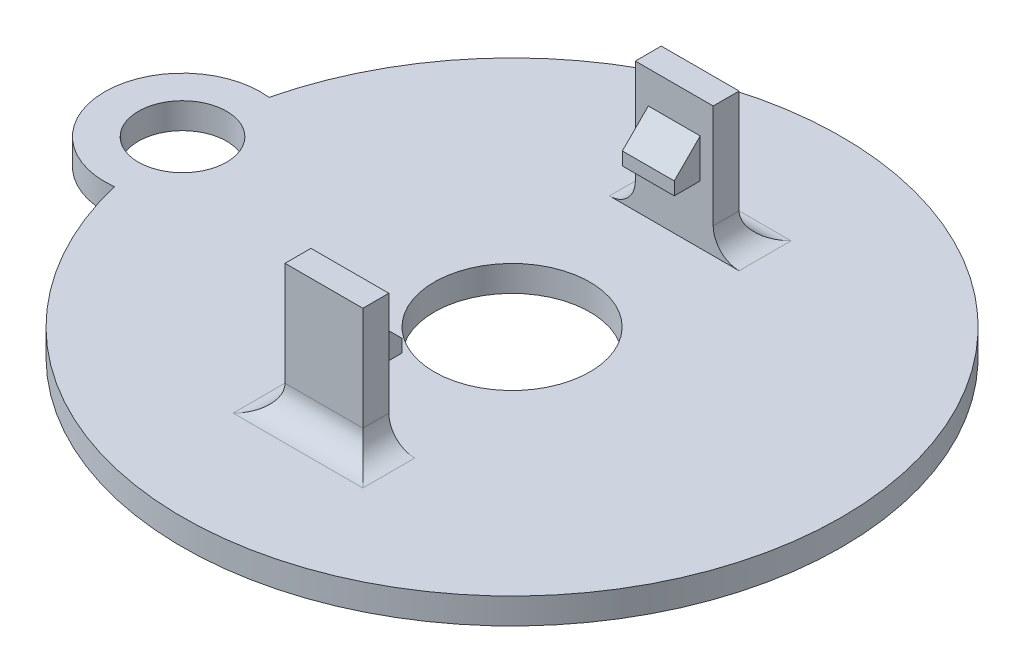
ISO-10303-21;
HEADER;
FILE_DESCRIPTION(('STEP AP214'),'2;1');
FILE_NAME('part.step','',(''),(''),'','','');
FILE_SCHEMA(('AUTOMOTIVE_DESIGN { 1 0 10303 214 1 1 1 1 }'));
ENDSEC;
DATA;
#1=APPLICATION_CONTEXT('core data for automotive mechanical design processes');
#2=APPLICATION_PROTOCOL_DEFINITION('international standard','automotive_design',2000,#1);
#3=PRODUCT_CONTEXT('',#1,'mechanical');
#4=PRODUCT('Part','Part','',(#3));
#5=PRODUCT_RELATED_PRODUCT_CATEGORY('part','',(#4));
#6=PRODUCT_DEFINITION_FORMATION('','',#4);
#7=PRODUCT_DEFINITION_CONTEXT('part definition',#1,'design');
#8=PRODUCT_DEFINITION('design','',#6,#7);
#9=PRODUCT_DEFINITION_SHAPE('','',#8);
#10=(LENGTH_UNIT() NAMED_UNIT(*) SI_UNIT(.MILLI.,.METRE.));
#11=(NAMED_UNIT(*) PLANE_ANGLE_UNIT() SI_UNIT($,.RADIAN.));
#12=(NAMED_UNIT(*) SI_UNIT($,.STERADIAN.) SOLID_ANGLE_UNIT());
#13=UNCERTAINTY_MEASURE_WITH_UNIT(LENGTH_MEASURE(1.E-05),#10,'distance_accuracy_value','');
#14=(GEOMETRIC_REPRESENTATION_CONTEXT(3) GLOBAL_UNCERTAINTY_ASSIGNED_CONTEXT((#13)) GLOBAL_UNIT_ASSIGNED_CONTEXT((#10,
#11,#12)) REPRESENTATION_CONTEXT('',''));
#15=CARTESIAN_POINT('',(0.,0.,0.));
#16=DIRECTION('',(0.,0.,1.));
#17=DIRECTION('',(1.,0.,0.));
#18=AXIS2_PLACEMENT_3D('',#15,#16,#17);
#19=CARTESIAN_POINT('',(-6.35,1.,0.));
#20=DIRECTION('',(0.,1.,0.));
#21=DIRECTION('',(0.,0.,1.));
#22=AXIS2_PLACEMENT_3D('',#19,#20,#21);
#23=PLANE('',#22);
#24=CARTESIAN_POINT('',(0.,1.,0.));
#25=DIRECTION('',(0.,1.,0.));
#26=DIRECTION('',(0.,0.,1.));
#27=AXIS2_PLACEMENT_3D('',#24,#25,#26);
#28=CIRCLE('',#27,3.);
#29=CARTESIAN_POINT('',(0.,1.,3.));
#30=VERTEX_POINT('',#29);
#31=EDGE_CURVE('E315',#30,#30,#28,.T.);
#32=ORIENTED_EDGE('',*,*,#31,.F.);
#33=EDGE_LOOP('',(#32));
#34=FACE_BOUND('',#33,.T.);
#35=CARTESIAN_POINT('',(-12.7,1.,0.));
#36=DIRECTION('',(0.,1.,0.));
#37=DIRECTION('',(0.,0.,1.));
#38=AXIS2_PLACEMENT_3D('',#35,#36,#37);
#39=CIRCLE('',#38,3.);
#40=CARTESIAN_POINT('',(-12.3456692913386,1.,-2.97900146842855));
#41=VERTEX_POINT('',#40);
#42=CARTESIAN_POINT('',(-12.3456692913386,1.,2.97900146842855));
#43=VERTEX_POINT('',#42);
#44=EDGE_CURVE('E321',#41,#43,#39,.T.);
#45=ORIENTED_EDGE('',*,*,#44,.T.);
#46=CARTESIAN_POINT('',(0.,1.,0.));
#47=DIRECTION('',(0.,1.,0.));
#48=DIRECTION('',(0.,0.,1.));
#49=AXIS2_PLACEMENT_3D('',#46,#47,#48);
#50=CIRCLE('',#49,12.7);
#51=EDGE_CURVE('E324',#43,#41,#50,.T.);
#52=ORIENTED_EDGE('',*,*,#51,.T.);
#53=EDGE_LOOP('',(#45,#52));
#54=FACE_BOUND('',#53,.T.);
#55=CARTESIAN_POINT('',(-12.7,1.,0.));
#56=DIRECTION('',(0.,1.,0.));
#57=DIRECTION('',(0.,0.,1.));
#58=AXIS2_PLACEMENT_3D('',#55,#56,#57);
#59=CIRCLE('',#58,1.7);
#60=CARTESIAN_POINT('',(-12.7,1.,1.7));
#61=VERTEX_POINT('',#60);
#62=EDGE_CURVE('E309',#61,#61,#59,.T.);
#63=ORIENTED_EDGE('',*,*,#62,.F.);
#64=EDGE_LOOP('',(#63));
#65=FACE_BOUND('',#64,.T.);
#66=DIRECTION('',(0.,0.,-1.));
#67=VECTOR('',#66,1.);
#68=CARTESIAN_POINT('',(2.5,1.,0.));
#69=LINE('',#68,#67);
#70=CARTESIAN_POINT('',(2.5,1.,-8.25));
#71=VERTEX_POINT('',#70);
#72=CARTESIAN_POINT('',(2.5,1.,-6.25));
#73=VERTEX_POINT('',#72);
#74=EDGE_CURVE('E348',#71,#73,#69,.F.);
#75=ORIENTED_EDGE('',*,*,#74,.T.);
#76=DIRECTION('',(1.,0.,0.));
#77=VECTOR('',#76,1.);
#78=CARTESIAN_POINT('',(-1.5,1.,-6.25));
#79=LINE('',#78,#77);
#80=CARTESIAN_POINT('',(-2.5,1.,-6.25));
#81=VERTEX_POINT('',#80);
#82=EDGE_CURVE('E279',#81,#73,#79,.T.);
#83=ORIENTED_EDGE('',*,*,#82,.F.);
#84=DIRECTION('',(0.,0.,1.));
#85=VECTOR('',#84,1.);
#86=CARTESIAN_POINT('',(-2.5,1.,0.));
#87=LINE('',#86,#85);
#88=CARTESIAN_POINT('',(-2.5,1.,-8.25));
#89=VERTEX_POINT('',#88);
#90=EDGE_CURVE('E351',#81,#89,#87,.F.);
#91=ORIENTED_EDGE('',*,*,#90,.T.);
#92=DIRECTION('',(-1.,0.,0.));
#93=VECTOR('',#92,1.);
#94=CARTESIAN_POINT('',(-6.35,1.,-8.25));
#95=LINE('',#94,#93);
#96=EDGE_CURVE('E346',#89,#71,#95,.F.);
#97=ORIENTED_EDGE('',*,*,#96,.T.);
#98=EDGE_LOOP('',(#75,#83,#91,#97));
#99=FACE_BOUND('',#98,.T.);
#100=DIRECTION('',(0.,0.,1.));
#101=VECTOR('',#100,1.);
#102=CARTESIAN_POINT('',(-2.5,1.,0.));
#103=LINE('',#102,#101);
#104=CARTESIAN_POINT('',(-2.5,1.,8.25));
#105=VERTEX_POINT('',#104);
#106=CARTESIAN_POINT('',(-2.5,1.,6.25));
#107=VERTEX_POINT('',#106);
#108=EDGE_CURVE('E343',#105,#107,#103,.F.);
#109=ORIENTED_EDGE('',*,*,#108,.T.);
#110=DIRECTION('',(-1.,0.,0.));
#111=VECTOR('',#110,1.);
#112=CARTESIAN_POINT('',(-1.5,1.,6.25));
#113=LINE('',#112,#111);
#114=CARTESIAN_POINT('',(2.5,1.,6.25));
#115=VERTEX_POINT('',#114);
#116=EDGE_CURVE('E277',#115,#107,#113,.T.);
#117=ORIENTED_EDGE('',*,*,#116,.F.);
#118=DIRECTION('',(0.,0.,-1.));
#119=VECTOR('',#118,1.);
#120=CARTESIAN_POINT('',(2.5,1.,0.));
#121=LINE('',#120,#119);
#122=CARTESIAN_POINT('',(2.5,1.,8.25));
#123=VERTEX_POINT('',#122);
#124=EDGE_CURVE('E341',#115,#123,#121,.F.);
#125=ORIENTED_EDGE('',*,*,#124,.T.);
#126=DIRECTION('',(1.,0.,0.));
#127=VECTOR('',#126,1.);
#128=CARTESIAN_POINT('',(-6.35,1.,8.25));
#129=LINE('',#128,#127);
#130=EDGE_CURVE('E339',#123,#105,#129,.F.);
#131=ORIENTED_EDGE('',*,*,#130,.T.);
#132=EDGE_LOOP('',(#109,#117,#125,#131));
#133=FACE_BOUND('',#132,.T.);
#134=ADVANCED_FACE('F39',(#34,#54,#65,#99,#133),#23,.T.);
#135=CARTESIAN_POINT('',(-6.35,0.,0.));
#136=DIRECTION('',(0.,1.,0.));
#137=DIRECTION('',(0.,0.,1.));
#138=AXIS2_PLACEMENT_3D('',#135,#136,#137);
#139=PLANE('',#138);
#140=CARTESIAN_POINT('',(-12.7,0.,0.));
#141=DIRECTION('',(0.,1.,0.));
#142=DIRECTION('',(0.,0.,1.));
#143=AXIS2_PLACEMENT_3D('',#140,#141,#142);
#144=CIRCLE('',#143,3.);
#145=CARTESIAN_POINT('',(-12.3456692913386,0.,-2.97900146842855));
#146=VERTEX_POINT('',#145);
#147=CARTESIAN_POINT('',(-12.3456692913386,0.,2.97900146842855));
#148=VERTEX_POINT('',#147);
#149=EDGE_CURVE('E318',#146,#148,#144,.T.);
#150=ORIENTED_EDGE('',*,*,#149,.F.);
#151=CARTESIAN_POINT('',(0.,0.,0.));
#152=DIRECTION('',(0.,1.,0.));
#153=DIRECTION('',(0.,0.,1.));
#154=AXIS2_PLACEMENT_3D('',#151,#152,#153);
#155=CIRCLE('',#154,12.7);
#156=EDGE_CURVE('E325',#148,#146,#155,.T.);
#157=ORIENTED_EDGE('',*,*,#156,.F.);
#158=EDGE_LOOP('',(#150,#157));
#159=FACE_BOUND('',#158,.T.);
#160=CARTESIAN_POINT('',(0.,0.,0.));
#161=DIRECTION('',(0.,1.,0.));
#162=DIRECTION('',(0.,0.,1.));
#163=AXIS2_PLACEMENT_3D('',#160,#161,#162);
#164=CIRCLE('',#163,3.);
#165=CARTESIAN_POINT('',(0.,0.,3.));
#166=VERTEX_POINT('',#165);
#167=EDGE_CURVE('E312',#166,#166,#164,.T.);
#168=ORIENTED_EDGE('',*,*,#167,.T.);
#169=EDGE_LOOP('',(#168));
#170=FACE_BOUND('',#169,.T.);
#171=CARTESIAN_POINT('',(-12.7,0.,0.));
#172=DIRECTION('',(0.,1.,0.));
#173=DIRECTION('',(0.,0.,1.));
#174=AXIS2_PLACEMENT_3D('',#171,#172,#173);
#175=CIRCLE('',#174,1.7);
#176=CARTESIAN_POINT('',(-12.7,0.,1.7));
#177=VERTEX_POINT('',#176);
#178=EDGE_CURVE('E308',#177,#177,#175,.T.);
#179=ORIENTED_EDGE('',*,*,#178,.T.);
#180=EDGE_LOOP('',(#179));
#181=FACE_BOUND('',#180,.T.);
#182=ADVANCED_FACE('F410',(#159,#170,#181),#139,.F.);
#183=CARTESIAN_POINT('',(-12.7,1.,0.));
#184=DIRECTION('',(0.,-1.,0.));
#185=DIRECTION('',(0.,0.,-1.));
#186=AXIS2_PLACEMENT_3D('',#183,#184,#185);
#187=CYLINDRICAL_SURFACE('',#186,3.);
#188=ORIENTED_EDGE('',*,*,#149,.T.);
#189=DIRECTION('',(0.,-1.,0.));
#190=VECTOR('',#189,1.);
#191=CARTESIAN_POINT('',(-12.3456692913386,1.,2.97900146842855));
#192=LINE('',#191,#190);
#193=EDGE_CURVE('E333',#43,#148,#192,.T.);
#194=ORIENTED_EDGE('',*,*,#193,.F.);
#195=ORIENTED_EDGE('',*,*,#44,.F.);
#196=DIRECTION('',(0.,-1.,0.));
#197=VECTOR('',#196,1.);
#198=CARTESIAN_POINT('',(-12.3456692913386,1.,-2.97900146842855));
#199=LINE('',#198,#197);
#200=EDGE_CURVE('E327',#41,#146,#199,.T.);
#201=ORIENTED_EDGE('',*,*,#200,.T.);
#202=EDGE_LOOP('',(#188,#194,#195,#201));
#203=FACE_BOUND('',#202,.T.);
#204=ADVANCED_FACE('F418',(#203),#187,.T.);
#205=CARTESIAN_POINT('',(0.,1.,0.));
#206=DIRECTION('',(0.,-1.,0.));
#207=DIRECTION('',(0.,0.,-1.));
#208=AXIS2_PLACEMENT_3D('',#205,#206,#207);
#209=CYLINDRICAL_SURFACE('',#208,12.7);
#210=ORIENTED_EDGE('',*,*,#156,.T.);
#211=ORIENTED_EDGE('',*,*,#200,.F.);
#212=ORIENTED_EDGE('',*,*,#51,.F.);
#213=ORIENTED_EDGE('',*,*,#193,.T.);
#214=EDGE_LOOP('',(#210,#211,#212,#213));
#215=FACE_BOUND('',#214,.T.);
#216=ADVANCED_FACE('F427',(#215),#209,.T.);
#217=CARTESIAN_POINT('',(0.,1.,0.));
#218=DIRECTION('',(0.,-1.,0.));
#219=DIRECTION('',(0.,0.,-1.));
#220=AXIS2_PLACEMENT_3D('',#217,#218,#219);
#221=CYLINDRICAL_SURFACE('',#220,3.);
#222=ORIENTED_EDGE('',*,*,#31,.T.);
#223=EDGE_LOOP('',(#222));
#224=FACE_BOUND('',#223,.T.);
#225=ORIENTED_EDGE('',*,*,#167,.F.);
#226=EDGE_LOOP('',(#225));
#227=FACE_BOUND('',#226,.T.);
#228=ADVANCED_FACE('F424',(#224,#227),#221,.F.);
#229=CARTESIAN_POINT('',(-12.7,1.,0.));
#230=DIRECTION('',(0.,-1.,0.));
#231=DIRECTION('',(0.,0.,-1.));
#232=AXIS2_PLACEMENT_3D('',#229,#230,#231);
#233=CYLINDRICAL_SURFACE('',#232,1.7);
#234=ORIENTED_EDGE('',*,*,#62,.T.);
#235=EDGE_LOOP('',(#234));
#236=FACE_BOUND('',#235,.T.);
#237=ORIENTED_EDGE('',*,*,#178,.F.);
#238=EDGE_LOOP('',(#237));
#239=FACE_BOUND('',#238,.T.);
#240=ADVANCED_FACE('F606',(#236,#239),#233,.F.);
#241=CARTESIAN_POINT('',(-1.5,6.,-7.25));
#242=DIRECTION('',(1.,0.,0.));
#243=DIRECTION('',(0.,0.,-1.));
#244=AXIS2_PLACEMENT_3D('',#241,#242,#243);
#245=PLANE('',#244);
#246=DIRECTION('',(0.,-1.,0.));
#247=VECTOR('',#246,1.);
#248=CARTESIAN_POINT('',(-1.5,6.,-7.25));
#249=LINE('',#248,#247);
#250=CARTESIAN_POINT('',(-1.5,6.,-7.25));
#251=VERTEX_POINT('',#250);
#252=CARTESIAN_POINT('',(-1.5,2.,-7.25));
#253=VERTEX_POINT('',#252);
#254=EDGE_CURVE('E297',#251,#253,#249,.T.);
#255=ORIENTED_EDGE('',*,*,#254,.T.);
#256=DIRECTION('',(0.,0.,1.));
#257=VECTOR('',#256,1.);
#258=CARTESIAN_POINT('',(-1.5,2.,-7.25));
#259=LINE('',#258,#257);
#260=CARTESIAN_POINT('',(-1.5,2.,-6.25));
#261=VERTEX_POINT('',#260);
#262=EDGE_CURVE('E336',#253,#261,#259,.T.);
#263=ORIENTED_EDGE('',*,*,#262,.T.);
#264=DIRECTION('',(0.,-1.,0.));
#265=VECTOR('',#264,1.);
#266=CARTESIAN_POINT('',(-1.5,6.,-6.25));
#267=LINE('',#266,#265);
#268=CARTESIAN_POINT('',(-1.5,6.,-6.25));
#269=VERTEX_POINT('',#268);
#270=EDGE_CURVE('E305',#269,#261,#267,.T.);
#271=ORIENTED_EDGE('',*,*,#270,.F.);
#272=DIRECTION('',(0.,0.,1.));
#273=VECTOR('',#272,1.);
#274=CARTESIAN_POINT('',(-1.5,6.,-7.25));
#275=LINE('',#274,#273);
#276=EDGE_CURVE('E288',#251,#269,#275,.T.);
#277=ORIENTED_EDGE('',*,*,#276,.F.);
#278=EDGE_LOOP('',(#255,#263,#271,#277));
#279=FACE_BOUND('',#278,.T.);
#280=ADVANCED_FACE('F600',(#279),#245,.F.);
#281=CARTESIAN_POINT('',(-1.5,6.,-6.25));
#282=DIRECTION('',(0.,0.,-1.));
#283=DIRECTION('',(-1.,0.,0.));
#284=AXIS2_PLACEMENT_3D('',#281,#282,#283);
#285=PLANE('',#284);
#286=DIRECTION('',(1.,0.,0.));
#287=VECTOR('',#286,1.);
#288=CARTESIAN_POINT('',(-1.,3.25,-6.25));
#289=LINE('',#288,#287);
#290=CARTESIAN_POINT('',(-1.,3.25,-6.25));
#291=VERTEX_POINT('',#290);
#292=CARTESIAN_POINT('',(1.,3.25,-6.25));
#293=VERTEX_POINT('',#292);
#294=EDGE_CURVE('E216',#291,#293,#289,.T.);
#295=ORIENTED_EDGE('',*,*,#294,.F.);
#296=DIRECTION('',(0.,1.,0.));
#297=VECTOR('',#296,1.);
#298=CARTESIAN_POINT('',(-1.,4.75,-6.25));
#299=LINE('',#298,#297);
#300=CARTESIAN_POINT('',(-1.,4.75,-6.25));
#301=VERTEX_POINT('',#300);
#302=EDGE_CURVE('E210',#291,#301,#299,.T.);
#303=ORIENTED_EDGE('',*,*,#302,.T.);
#304=DIRECTION('',(1.,0.,0.));
#305=VECTOR('',#304,1.);
#306=CARTESIAN_POINT('',(-1.,4.75,-6.25));
#307=LINE('',#306,#305);
#308=CARTESIAN_POINT('',(1.,4.75,-6.25));
#309=VERTEX_POINT('',#308);
#310=EDGE_CURVE('E219',#301,#309,#307,.T.);
#311=ORIENTED_EDGE('',*,*,#310,.T.);
#312=DIRECTION('',(0.,1.,0.));
#313=VECTOR('',#312,1.);
#314=CARTESIAN_POINT('',(1.,4.75,-6.25));
#315=LINE('',#314,#313);
#316=EDGE_CURVE('E228',#293,#309,#315,.T.);
#317=ORIENTED_EDGE('',*,*,#316,.F.);
#318=EDGE_LOOP('',(#295,#303,#311,#317));
#319=FACE_BOUND('',#318,.T.);
#320=ORIENTED_EDGE('',*,*,#82,.T.);
#321=CARTESIAN_POINT('',(2.5,2.,-6.25));
#322=DIRECTION('',(0.,0.,-1.));
#323=DIRECTION('',(-1.,0.,0.));
#324=AXIS2_PLACEMENT_3D('',#321,#322,#323);
#325=CIRCLE('',#324,1.);
#326=CARTESIAN_POINT('',(1.5,2.,-6.25));
#327=VERTEX_POINT('',#326);
#328=EDGE_CURVE('E11',#73,#327,#325,.T.);
#329=ORIENTED_EDGE('',*,*,#328,.T.);
#330=DIRECTION('',(0.,-1.,0.));
#331=VECTOR('',#330,1.);
#332=CARTESIAN_POINT('',(1.5,6.,-6.25));
#333=LINE('',#332,#331);
#334=CARTESIAN_POINT('',(1.5,6.,-6.25));
#335=VERTEX_POINT('',#334);
#336=EDGE_CURVE('E303',#335,#327,#333,.T.);
#337=ORIENTED_EDGE('',*,*,#336,.F.);
#338=DIRECTION('',(1.,0.,0.));
#339=VECTOR('',#338,1.);
#340=CARTESIAN_POINT('',(-1.5,6.,-6.25));
#341=LINE('',#340,#339);
#342=EDGE_CURVE('E291',#269,#335,#341,.T.);
#343=ORIENTED_EDGE('',*,*,#342,.F.);
#344=ORIENTED_EDGE('',*,*,#270,.T.);
#345=CARTESIAN_POINT('',(-2.5,2.,-6.25));
#346=DIRECTION('',(0.,0.,-1.));
#347=DIRECTION('',(-1.,0.,0.));
#348=AXIS2_PLACEMENT_3D('',#345,#346,#347);
#349=CIRCLE('',#348,1.);
#350=EDGE_CURVE('E363',#261,#81,#349,.T.);
#351=ORIENTED_EDGE('',*,*,#350,.T.);
#352=EDGE_LOOP('',(#320,#329,#337,#343,#344,#351));
#353=FACE_BOUND('',#352,.T.);
#354=ADVANCED_FACE('F593',(#319,#353),#285,.F.);
#355=CARTESIAN_POINT('',(1.5,6.,-7.25));
#356=DIRECTION('',(-1.,0.,0.));
#357=DIRECTION('',(0.,0.,1.));
#358=AXIS2_PLACEMENT_3D('',#355,#356,#357);
#359=PLANE('',#358);
#360=ORIENTED_EDGE('',*,*,#336,.T.);
#361=DIRECTION('',(0.,0.,-1.));
#362=VECTOR('',#361,1.);
#363=CARTESIAN_POINT('',(1.5,2.,-7.25));
#364=LINE('',#363,#362);
#365=CARTESIAN_POINT('',(1.5,2.,-7.25));
#366=VERTEX_POINT('',#365);
#367=EDGE_CURVE('E61',#327,#366,#364,.T.);
#368=ORIENTED_EDGE('',*,*,#367,.T.);
#369=DIRECTION('',(0.,-1.,0.));
#370=VECTOR('',#369,1.);
#371=CARTESIAN_POINT('',(1.5,6.,-7.25));
#372=LINE('',#371,#370);
#373=CARTESIAN_POINT('',(1.5,6.,-7.25));
#374=VERTEX_POINT('',#373);
#375=EDGE_CURVE('E301',#374,#366,#372,.T.);
#376=ORIENTED_EDGE('',*,*,#375,.F.);
#377=DIRECTION('',(0.,0.,-1.));
#378=VECTOR('',#377,1.);
#379=CARTESIAN_POINT('',(1.5,6.,-7.25));
#380=LINE('',#379,#378);
#381=EDGE_CURVE('E293',#335,#374,#380,.T.);
#382=ORIENTED_EDGE('',*,*,#381,.F.);
#383=EDGE_LOOP('',(#360,#368,#376,#382));
#384=FACE_BOUND('',#383,.T.);
#385=ADVANCED_FACE('F585',(#384),#359,.F.);
#386=CARTESIAN_POINT('',(-1.5,6.,-7.25));
#387=DIRECTION('',(0.,0.,1.));
#388=DIRECTION('',(1.,0.,0.));
#389=AXIS2_PLACEMENT_3D('',#386,#387,#388);
#390=PLANE('',#389);
#391=ORIENTED_EDGE('',*,*,#375,.T.);
#392=DIRECTION('',(-1.,0.,0.));
#393=VECTOR('',#392,1.);
#394=CARTESIAN_POINT('',(-1.5,2.,-7.25));
#395=LINE('',#394,#393);
#396=EDGE_CURVE('E359',#366,#253,#395,.T.);
#397=ORIENTED_EDGE('',*,*,#396,.T.);
#398=ORIENTED_EDGE('',*,*,#254,.F.);
#399=DIRECTION('',(-1.,0.,0.));
#400=VECTOR('',#399,1.);
#401=CARTESIAN_POINT('',(-1.5,6.,-7.25));
#402=LINE('',#401,#400);
#403=EDGE_CURVE('E295',#374,#251,#402,.T.);
#404=ORIENTED_EDGE('',*,*,#403,.F.);
#405=EDGE_LOOP('',(#391,#397,#398,#404));
#406=FACE_BOUND('',#405,.T.);
#407=ADVANCED_FACE('F577',(#406),#390,.F.);
#408=CARTESIAN_POINT('',(0.,6.,0.));
#409=DIRECTION('',(0.,1.,0.));
#410=DIRECTION('',(0.,0.,1.));
#411=AXIS2_PLACEMENT_3D('',#408,#409,#410);
#412=PLANE('',#411);
#413=ORIENTED_EDGE('',*,*,#276,.T.);
#414=ORIENTED_EDGE('',*,*,#342,.T.);
#415=ORIENTED_EDGE('',*,*,#381,.T.);
#416=ORIENTED_EDGE('',*,*,#403,.T.);
#417=EDGE_LOOP('',(#413,#414,#415,#416));
#418=FACE_BOUND('',#417,.T.);
#419=ADVANCED_FACE('F570',(#418),#412,.T.);
#420=CARTESIAN_POINT('',(-1.5,6.,6.25));
#421=DIRECTION('',(1.,0.,0.));
#422=DIRECTION('',(0.,0.,-1.));
#423=AXIS2_PLACEMENT_3D('',#420,#421,#422);
#424=PLANE('',#423);
#425=DIRECTION('',(0.,-1.,0.));
#426=VECTOR('',#425,1.);
#427=CARTESIAN_POINT('',(-1.5,6.,6.25));
#428=LINE('',#427,#426);
#429=CARTESIAN_POINT('',(-1.5,6.,6.25));
#430=VERTEX_POINT('',#429);
#431=CARTESIAN_POINT('',(-1.5,2.,6.25));
#432=VERTEX_POINT('',#431);
#433=EDGE_CURVE('E273',#430,#432,#428,.T.);
#434=ORIENTED_EDGE('',*,*,#433,.T.);
#435=DIRECTION('',(0.,0.,1.));
#436=VECTOR('',#435,1.);
#437=CARTESIAN_POINT('',(-1.5,2.,6.25));
#438=LINE('',#437,#436);
#439=CARTESIAN_POINT('',(-1.5,2.,7.25));
#440=VERTEX_POINT('',#439);
#441=EDGE_CURVE('E353',#432,#440,#438,.T.);
#442=ORIENTED_EDGE('',*,*,#441,.T.);
#443=DIRECTION('',(0.,-1.,0.));
#444=VECTOR('',#443,1.);
#445=CARTESIAN_POINT('',(-1.5,6.,7.25));
#446=LINE('',#445,#444);
#447=CARTESIAN_POINT('',(-1.5,6.,7.25));
#448=VERTEX_POINT('',#447);
#449=EDGE_CURVE('E259',#448,#440,#446,.T.);
#450=ORIENTED_EDGE('',*,*,#449,.F.);
#451=DIRECTION('',(0.,0.,1.));
#452=VECTOR('',#451,1.);
#453=CARTESIAN_POINT('',(-1.5,6.,6.25));
#454=LINE('',#453,#452);
#455=EDGE_CURVE('E280',#430,#448,#454,.T.);
#456=ORIENTED_EDGE('',*,*,#455,.F.);
#457=EDGE_LOOP('',(#434,#442,#450,#456));
#458=FACE_BOUND('',#457,.T.);
#459=ADVANCED_FACE('F405',(#458),#424,.F.);
#460=CARTESIAN_POINT('',(-1.5,6.,7.25));
#461=DIRECTION('',(0.,0.,-1.));
#462=DIRECTION('',(-1.,0.,0.));
#463=AXIS2_PLACEMENT_3D('',#460,#461,#462);
#464=PLANE('',#463);
#465=ORIENTED_EDGE('',*,*,#449,.T.);
#466=DIRECTION('',(1.,0.,0.));
#467=VECTOR('',#466,1.);
#468=CARTESIAN_POINT('',(-1.5,2.,7.25));
#469=LINE('',#468,#467);
#470=CARTESIAN_POINT('',(1.5,2.,7.25));
#471=VERTEX_POINT('',#470);
#472=EDGE_CURVE('E361',#440,#471,#469,.T.);
#473=ORIENTED_EDGE('',*,*,#472,.T.);
#474=DIRECTION('',(0.,-1.,0.));
#475=VECTOR('',#474,1.);
#476=CARTESIAN_POINT('',(1.5,6.,7.25));
#477=LINE('',#476,#475);
#478=CARTESIAN_POINT('',(1.5,6.,7.25));
#479=VERTEX_POINT('',#478);
#480=EDGE_CURVE('E267',#479,#471,#477,.T.);
#481=ORIENTED_EDGE('',*,*,#480,.F.);
#482=DIRECTION('',(1.,0.,0.));
#483=VECTOR('',#482,1.);
#484=CARTESIAN_POINT('',(-1.5,6.,7.25));
#485=LINE('',#484,#483);
#486=EDGE_CURVE('E284',#448,#479,#485,.T.);
#487=ORIENTED_EDGE('',*,*,#486,.F.);
#488=EDGE_LOOP('',(#465,#473,#481,#487));
#489=FACE_BOUND('',#488,.T.);
#490=ADVANCED_FACE('F403',(#489),#464,.F.);
#491=CARTESIAN_POINT('',(1.5,6.,6.25));
#492=DIRECTION('',(-1.,0.,0.));
#493=DIRECTION('',(0.,0.,1.));
#494=AXIS2_PLACEMENT_3D('',#491,#492,#493);
#495=PLANE('',#494);
#496=ORIENTED_EDGE('',*,*,#480,.T.);
#497=DIRECTION('',(0.,0.,-1.));
#498=VECTOR('',#497,1.);
#499=CARTESIAN_POINT('',(1.5,2.,6.25));
#500=LINE('',#499,#498);
#501=CARTESIAN_POINT('',(1.5,2.,6.25));
#502=VERTEX_POINT('',#501);
#503=EDGE_CURVE('E356',#471,#502,#500,.T.);
#504=ORIENTED_EDGE('',*,*,#503,.T.);
#505=DIRECTION('',(0.,-1.,0.));
#506=VECTOR('',#505,1.);
#507=CARTESIAN_POINT('',(1.5,6.,6.25));
#508=LINE('',#507,#506);
#509=CARTESIAN_POINT('',(1.5,6.,6.25));
#510=VERTEX_POINT('',#509);
#511=EDGE_CURVE('E270',#510,#502,#508,.T.);
#512=ORIENTED_EDGE('',*,*,#511,.F.);
#513=DIRECTION('',(0.,0.,-1.));
#514=VECTOR('',#513,1.);
#515=CARTESIAN_POINT('',(1.5,6.,6.25));
#516=LINE('',#515,#514);
#517=EDGE_CURVE('E282',#479,#510,#516,.T.);
#518=ORIENTED_EDGE('',*,*,#517,.F.);
#519=EDGE_LOOP('',(#496,#504,#512,#518));
#520=FACE_BOUND('',#519,.T.);
#521=ADVANCED_FACE('F391',(#520),#495,.F.);
#522=CARTESIAN_POINT('',(-1.5,6.,6.25));
#523=DIRECTION('',(0.,0.,1.));
#524=DIRECTION('',(1.,0.,0.));
#525=AXIS2_PLACEMENT_3D('',#522,#523,#524);
#526=PLANE('',#525);
#527=DIRECTION('',(1.,0.,0.));
#528=VECTOR('',#527,1.);
#529=CARTESIAN_POINT('',(-1.,4.75,6.25));
#530=LINE('',#529,#528);
#531=CARTESIAN_POINT('',(-1.,4.75,6.25));
#532=VERTEX_POINT('',#531);
#533=CARTESIAN_POINT('',(1.,4.75,6.25));
#534=VERTEX_POINT('',#533);
#535=EDGE_CURVE('E256',#532,#534,#530,.T.);
#536=ORIENTED_EDGE('',*,*,#535,.F.);
#537=DIRECTION('',(0.,-1.,0.));
#538=VECTOR('',#537,1.);
#539=CARTESIAN_POINT('',(-1.,3.25,6.25));
#540=LINE('',#539,#538);
#541=CARTESIAN_POINT('',(-1.,3.25,6.25));
#542=VERTEX_POINT('',#541);
#543=EDGE_CURVE('E244',#532,#542,#540,.T.);
#544=ORIENTED_EDGE('',*,*,#543,.T.);
#545=DIRECTION('',(1.,0.,0.));
#546=VECTOR('',#545,1.);
#547=CARTESIAN_POINT('',(-1.,3.25,6.25));
#548=LINE('',#547,#546);
#549=CARTESIAN_POINT('',(1.,3.25,6.25));
#550=VERTEX_POINT('',#549);
#551=EDGE_CURVE('E255',#542,#550,#548,.T.);
#552=ORIENTED_EDGE('',*,*,#551,.T.);
#553=DIRECTION('',(0.,-1.,0.));
#554=VECTOR('',#553,1.);
#555=CARTESIAN_POINT('',(1.,3.25,6.25));
#556=LINE('',#555,#554);
#557=EDGE_CURVE('E232',#534,#550,#556,.T.);
#558=ORIENTED_EDGE('',*,*,#557,.F.);
#559=EDGE_LOOP('',(#536,#544,#552,#558));
#560=FACE_BOUND('',#559,.T.);
#561=ORIENTED_EDGE('',*,*,#116,.T.);
#562=CARTESIAN_POINT('',(-2.5,2.,6.25));
#563=DIRECTION('',(0.,0.,1.));
#564=DIRECTION('',(1.,0.,0.));
#565=AXIS2_PLACEMENT_3D('',#562,#563,#564);
#566=CIRCLE('',#565,1.);
#567=EDGE_CURVE('E366',#107,#432,#566,.T.);
#568=ORIENTED_EDGE('',*,*,#567,.T.);
#569=ORIENTED_EDGE('',*,*,#433,.F.);
#570=DIRECTION('',(-1.,0.,0.));
#571=VECTOR('',#570,1.);
#572=CARTESIAN_POINT('',(-1.5,6.,6.25));
#573=LINE('',#572,#571);
#574=EDGE_CURVE('E276',#510,#430,#573,.T.);
#575=ORIENTED_EDGE('',*,*,#574,.F.);
#576=ORIENTED_EDGE('',*,*,#511,.T.);
#577=CARTESIAN_POINT('',(2.5,2.,6.25));
#578=DIRECTION('',(0.,0.,1.));
#579=DIRECTION('',(1.,0.,0.));
#580=AXIS2_PLACEMENT_3D('',#577,#578,#579);
#581=CIRCLE('',#580,1.);
#582=EDGE_CURVE('E48',#502,#115,#581,.T.);
#583=ORIENTED_EDGE('',*,*,#582,.T.);
#584=EDGE_LOOP('',(#561,#568,#569,#575,#576,#583));
#585=FACE_BOUND('',#584,.T.);
#586=ADVANCED_FACE('F396',(#560,#585),#526,.F.);
#587=CARTESIAN_POINT('',(0.,6.,0.));
#588=DIRECTION('',(0.,1.,0.));
#589=DIRECTION('',(0.,0.,1.));
#590=AXIS2_PLACEMENT_3D('',#587,#588,#589);
#591=PLANE('',#590);
#592=ORIENTED_EDGE('',*,*,#455,.T.);
#593=ORIENTED_EDGE('',*,*,#486,.T.);
#594=ORIENTED_EDGE('',*,*,#517,.T.);
#595=ORIENTED_EDGE('',*,*,#574,.T.);
#596=EDGE_LOOP('',(#592,#593,#594,#595));
#597=FACE_BOUND('',#596,.T.);
#598=ADVANCED_FACE('F400',(#597),#591,.T.);
#599=CARTESIAN_POINT('',(-1.,4.75,6.25));
#600=DIRECTION('',(0.,0.707106781186547,-0.707106781186547));
#601=DIRECTION('',(0.,0.707106781186548,0.707106781186548));
#602=AXIS2_PLACEMENT_3D('',#599,#600,#601);
#603=PLANE('',#602);
#604=ORIENTED_EDGE('',*,*,#535,.T.);
#605=DIRECTION('',(0.,0.707106781186548,0.707106781186548));
#606=VECTOR('',#605,1.);
#607=CARTESIAN_POINT('',(1.,4.75,6.25));
#608=LINE('',#607,#606);
#609=CARTESIAN_POINT('',(1.,3.75,5.25));
#610=VERTEX_POINT('',#609);
#611=EDGE_CURVE('E241',#610,#534,#608,.T.);
#612=ORIENTED_EDGE('',*,*,#611,.F.);
#613=DIRECTION('',(1.,0.,0.));
#614=VECTOR('',#613,1.);
#615=CARTESIAN_POINT('',(-1.,3.75,5.25));
#616=LINE('',#615,#614);
#617=CARTESIAN_POINT('',(-1.,3.75,5.25));
#618=VERTEX_POINT('',#617);
#619=EDGE_CURVE('E260',#618,#610,#616,.T.);
#620=ORIENTED_EDGE('',*,*,#619,.F.);
#621=DIRECTION('',(0.,0.707106781186548,0.707106781186548));
#622=VECTOR('',#621,1.);
#623=CARTESIAN_POINT('',(-1.,4.75,6.25));
#624=LINE('',#623,#622);
#625=EDGE_CURVE('E252',#618,#532,#624,.T.);
#626=ORIENTED_EDGE('',*,*,#625,.T.);
#627=EDGE_LOOP('',(#604,#612,#620,#626));
#628=FACE_BOUND('',#627,.T.);
#629=ADVANCED_FACE('F530',(#628),#603,.T.);
#630=CARTESIAN_POINT('',(-1.,3.25,5.25));
#631=DIRECTION('',(0.,0.,-1.));
#632=DIRECTION('',(-1.,0.,0.));
#633=AXIS2_PLACEMENT_3D('',#630,#631,#632);
#634=PLANE('',#633);
#635=ORIENTED_EDGE('',*,*,#619,.T.);
#636=DIRECTION('',(0.,1.,0.));
#637=VECTOR('',#636,1.);
#638=CARTESIAN_POINT('',(1.,3.25,5.25));
#639=LINE('',#638,#637);
#640=CARTESIAN_POINT('',(1.,3.25,5.25));
#641=VERTEX_POINT('',#640);
#642=EDGE_CURVE('E238',#641,#610,#639,.T.);
#643=ORIENTED_EDGE('',*,*,#642,.F.);
#644=DIRECTION('',(1.,0.,0.));
#645=VECTOR('',#644,1.);
#646=CARTESIAN_POINT('',(-1.,3.25,5.25));
#647=LINE('',#646,#645);
#648=CARTESIAN_POINT('',(-1.,3.25,5.25));
#649=VERTEX_POINT('',#648);
#650=EDGE_CURVE('E262',#649,#641,#647,.T.);
#651=ORIENTED_EDGE('',*,*,#650,.F.);
#652=DIRECTION('',(0.,1.,0.));
#653=VECTOR('',#652,1.);
#654=CARTESIAN_POINT('',(-1.,3.25,5.25));
#655=LINE('',#654,#653);
#656=EDGE_CURVE('E249',#649,#618,#655,.T.);
#657=ORIENTED_EDGE('',*,*,#656,.T.);
#658=EDGE_LOOP('',(#635,#643,#651,#657));
#659=FACE_BOUND('',#658,.T.);
#660=ADVANCED_FACE('F522',(#659),#634,.T.);
#661=CARTESIAN_POINT('',(-1.,3.25,6.25));
#662=DIRECTION('',(0.,-1.,0.));
#663=DIRECTION('',(0.,0.,-1.));
#664=AXIS2_PLACEMENT_3D('',#661,#662,#663);
#665=PLANE('',#664);
#666=ORIENTED_EDGE('',*,*,#650,.T.);
#667=DIRECTION('',(0.,0.,-1.));
#668=VECTOR('',#667,1.);
#669=CARTESIAN_POINT('',(1.,3.25,6.25));
#670=LINE('',#669,#668);
#671=EDGE_CURVE('E235',#550,#641,#670,.T.);
#672=ORIENTED_EDGE('',*,*,#671,.F.);
#673=ORIENTED_EDGE('',*,*,#551,.F.);
#674=DIRECTION('',(0.,0.,-1.));
#675=VECTOR('',#674,1.);
#676=CARTESIAN_POINT('',(-1.,3.25,6.25));
#677=LINE('',#676,#675);
#678=EDGE_CURVE('E246',#542,#649,#677,.T.);
#679=ORIENTED_EDGE('',*,*,#678,.T.);
#680=EDGE_LOOP('',(#666,#672,#673,#679));
#681=FACE_BOUND('',#680,.T.);
#682=ADVANCED_FACE('F514',(#681),#665,.T.);
#683=CARTESIAN_POINT('',(-1.,0.,0.));
#684=DIRECTION('',(-1.,0.,0.));
#685=DIRECTION('',(0.,0.,1.));
#686=AXIS2_PLACEMENT_3D('',#683,#684,#685);
#687=PLANE('',#686);
#688=ORIENTED_EDGE('',*,*,#543,.F.);
#689=ORIENTED_EDGE('',*,*,#625,.F.);
#690=ORIENTED_EDGE('',*,*,#656,.F.);
#691=ORIENTED_EDGE('',*,*,#678,.F.);
#692=EDGE_LOOP('',(#688,#689,#690,#691));
#693=FACE_BOUND('',#692,.T.);
#694=ADVANCED_FACE('F506',(#693),#687,.T.);
#695=CARTESIAN_POINT('',(1.,0.,0.));
#696=DIRECTION('',(-1.,0.,0.));
#697=DIRECTION('',(0.,0.,1.));
#698=AXIS2_PLACEMENT_3D('',#695,#696,#697);
#699=PLANE('',#698);
#700=ORIENTED_EDGE('',*,*,#557,.T.);
#701=ORIENTED_EDGE('',*,*,#671,.T.);
#702=ORIENTED_EDGE('',*,*,#642,.T.);
#703=ORIENTED_EDGE('',*,*,#611,.T.);
#704=EDGE_LOOP('',(#700,#701,#702,#703));
#705=FACE_BOUND('',#704,.T.);
#706=ADVANCED_FACE('F499',(#705),#699,.F.);
#707=CARTESIAN_POINT('',(-1.,3.25,-5.25));
#708=DIRECTION('',(0.,-1.,0.));
#709=DIRECTION('',(0.,0.,-1.));
#710=AXIS2_PLACEMENT_3D('',#707,#708,#709);
#711=PLANE('',#710);
#712=ORIENTED_EDGE('',*,*,#294,.T.);
#713=DIRECTION('',(0.,0.,-1.));
#714=VECTOR('',#713,1.);
#715=CARTESIAN_POINT('',(1.,3.25,-5.25));
#716=LINE('',#715,#714);
#717=CARTESIAN_POINT('',(1.,3.25,-5.25));
#718=VERTEX_POINT('',#717);
#719=EDGE_CURVE('E196',#718,#293,#716,.T.);
#720=ORIENTED_EDGE('',*,*,#719,.F.);
#721=DIRECTION('',(1.,0.,0.));
#722=VECTOR('',#721,1.);
#723=CARTESIAN_POINT('',(-1.,3.25,-5.25));
#724=LINE('',#723,#722);
#725=CARTESIAN_POINT('',(-1.,3.25,-5.25));
#726=VERTEX_POINT('',#725);
#727=EDGE_CURVE('E190',#726,#718,#724,.T.);
#728=ORIENTED_EDGE('',*,*,#727,.F.);
#729=DIRECTION('',(0.,0.,-1.));
#730=VECTOR('',#729,1.);
#731=CARTESIAN_POINT('',(-1.,3.25,-5.25));
#732=LINE('',#731,#730);
#733=EDGE_CURVE('E194',#726,#291,#732,.T.);
#734=ORIENTED_EDGE('',*,*,#733,.T.);
#735=EDGE_LOOP('',(#712,#720,#728,#734));
#736=FACE_BOUND('',#735,.T.);
#737=ADVANCED_FACE('F193',(#736),#711,.T.);
#738=CARTESIAN_POINT('',(-1.,3.75,-5.25));
#739=DIRECTION('',(0.,0.,1.));
#740=DIRECTION('',(0.,-1.,0.));
#741=AXIS2_PLACEMENT_3D('',#738,#739,#740);
#742=PLANE('',#741);
#743=ORIENTED_EDGE('',*,*,#727,.T.);
#744=DIRECTION('',(0.,-1.,0.));
#745=VECTOR('',#744,1.);
#746=CARTESIAN_POINT('',(1.,3.75,-5.25));
#747=LINE('',#746,#745);
#748=CARTESIAN_POINT('',(1.,3.75,-5.25));
#749=VERTEX_POINT('',#748);
#750=EDGE_CURVE('E211',#749,#718,#747,.T.);
#751=ORIENTED_EDGE('',*,*,#750,.F.);
#752=DIRECTION('',(1.,0.,0.));
#753=VECTOR('',#752,1.);
#754=CARTESIAN_POINT('',(-1.,3.75,-5.25));
#755=LINE('',#754,#753);
#756=CARTESIAN_POINT('',(-1.,3.75,-5.25));
#757=VERTEX_POINT('',#756);
#758=EDGE_CURVE('E201',#757,#749,#755,.T.);
#759=ORIENTED_EDGE('',*,*,#758,.F.);
#760=DIRECTION('',(0.,-1.,0.));
#761=VECTOR('',#760,1.);
#762=CARTESIAN_POINT('',(-1.,3.75,-5.25));
#763=LINE('',#762,#761);
#764=EDGE_CURVE('E209',#757,#726,#763,.T.);
#765=ORIENTED_EDGE('',*,*,#764,.T.);
#766=EDGE_LOOP('',(#743,#751,#759,#765));
#767=FACE_BOUND('',#766,.T.);
#768=ADVANCED_FACE('F213',(#767),#742,.T.);
#769=CARTESIAN_POINT('',(-1.,3.75,-5.25));
#770=DIRECTION('',(0.,0.707106781186548,0.707106781186547));
#771=DIRECTION('',(0.,-0.707106781186547,0.707106781186548));
#772=AXIS2_PLACEMENT_3D('',#769,#770,#771);
#773=PLANE('',#772);
#774=ORIENTED_EDGE('',*,*,#758,.T.);
#775=DIRECTION('',(0.,-0.707106781186547,0.707106781186548));
#776=VECTOR('',#775,1.);
#777=CARTESIAN_POINT('',(1.,3.75,-5.25));
#778=LINE('',#777,#776);
#779=EDGE_CURVE('E225',#309,#749,#778,.T.);
#780=ORIENTED_EDGE('',*,*,#779,.F.);
#781=ORIENTED_EDGE('',*,*,#310,.F.);
#782=DIRECTION('',(0.,-0.707106781186547,0.707106781186548));
#783=VECTOR('',#782,1.);
#784=CARTESIAN_POINT('',(-1.,3.75,-5.25));
#785=LINE('',#784,#783);
#786=EDGE_CURVE('E215',#301,#757,#785,.T.);
#787=ORIENTED_EDGE('',*,*,#786,.T.);
#788=EDGE_LOOP('',(#774,#780,#781,#787));
#789=FACE_BOUND('',#788,.T.);
#790=ADVANCED_FACE('F479',(#789),#773,.T.);
#791=CARTESIAN_POINT('',(-1.,0.,0.));
#792=DIRECTION('',(-1.,0.,0.));
#793=DIRECTION('',(0.,0.,1.));
#794=AXIS2_PLACEMENT_3D('',#791,#792,#793);
#795=PLANE('',#794);
#796=ORIENTED_EDGE('',*,*,#733,.F.);
#797=ORIENTED_EDGE('',*,*,#764,.F.);
#798=ORIENTED_EDGE('',*,*,#786,.F.);
#799=ORIENTED_EDGE('',*,*,#302,.F.);
#800=EDGE_LOOP('',(#796,#797,#798,#799));
#801=FACE_BOUND('',#800,.T.);
#802=ADVANCED_FACE('F207',(#801),#795,.T.);
#803=CARTESIAN_POINT('',(1.,0.,0.));
#804=DIRECTION('',(-1.,0.,0.));
#805=DIRECTION('',(0.,0.,1.));
#806=AXIS2_PLACEMENT_3D('',#803,#804,#805);
#807=PLANE('',#806);
#808=ORIENTED_EDGE('',*,*,#719,.T.);
#809=ORIENTED_EDGE('',*,*,#316,.T.);
#810=ORIENTED_EDGE('',*,*,#779,.T.);
#811=ORIENTED_EDGE('',*,*,#750,.T.);
#812=EDGE_LOOP('',(#808,#809,#810,#811));
#813=FACE_BOUND('',#812,.T.);
#814=ADVANCED_FACE('F445',(#813),#807,.F.);
#815=CARTESIAN_POINT('',(2.5,2.,-7.25));
#816=DIRECTION('',(0.,0.,-1.));
#817=DIRECTION('',(-1.,0.,0.));
#818=AXIS2_PLACEMENT_3D('',#815,#816,#817);
#819=CYLINDRICAL_SURFACE('',#818,1.);
#820=ORIENTED_EDGE('',*,*,#328,.F.);
#821=ORIENTED_EDGE('',*,*,#74,.F.);
#822=CARTESIAN_POINT('',(2.5,2.,-8.25));
#823=DIRECTION('',(-0.707106781186548,0.,-0.707106781186547));
#824=DIRECTION('',(-0.707106781186547,0.,0.707106781186548));
#825=AXIS2_PLACEMENT_3D('',#822,#823,#824);
#826=ELLIPSE('',#825,1.41421356237309,1.);
#827=EDGE_CURVE('E202',#366,#71,#826,.F.);
#828=ORIENTED_EDGE('',*,*,#827,.F.);
#829=ORIENTED_EDGE('',*,*,#367,.F.);
#830=EDGE_LOOP('',(#820,#821,#828,#829));
#831=FACE_BOUND('',#830,.T.);
#832=ADVANCED_FACE('F441',(#831),#819,.F.);
#833=CARTESIAN_POINT('',(-1.5,2.,-8.25));
#834=DIRECTION('',(-1.,0.,0.));
#835=DIRECTION('',(0.,0.,1.));
#836=AXIS2_PLACEMENT_3D('',#833,#834,#835);
#837=CYLINDRICAL_SURFACE('',#836,1.);
#838=ORIENTED_EDGE('',*,*,#827,.T.);
#839=ORIENTED_EDGE('',*,*,#96,.F.);
#840=CARTESIAN_POINT('',(-2.5,2.,-8.25));
#841=DIRECTION('',(-0.707106781186548,0.,0.707106781186547));
#842=DIRECTION('',(-0.707106781186547,0.,-0.707106781186548));
#843=AXIS2_PLACEMENT_3D('',#840,#841,#842);
#844=ELLIPSE('',#843,1.41421356237309,1.);
#845=EDGE_CURVE('E370',#253,#89,#844,.F.);
#846=ORIENTED_EDGE('',*,*,#845,.F.);
#847=ORIENTED_EDGE('',*,*,#396,.F.);
#848=EDGE_LOOP('',(#838,#839,#846,#847));
#849=FACE_BOUND('',#848,.T.);
#850=ADVANCED_FACE('F437',(#849),#837,.F.);
#851=CARTESIAN_POINT('',(-2.5,2.,-7.25));
#852=DIRECTION('',(0.,0.,1.));
#853=DIRECTION('',(1.,0.,0.));
#854=AXIS2_PLACEMENT_3D('',#851,#852,#853);
#855=CYLINDRICAL_SURFACE('',#854,1.);
#856=ORIENTED_EDGE('',*,*,#845,.T.);
#857=ORIENTED_EDGE('',*,*,#90,.F.);
#858=ORIENTED_EDGE('',*,*,#350,.F.);
#859=ORIENTED_EDGE('',*,*,#262,.F.);
#860=EDGE_LOOP('',(#856,#857,#858,#859));
#861=FACE_BOUND('',#860,.T.);
#862=ADVANCED_FACE('F434',(#861),#855,.F.);
#863=CARTESIAN_POINT('',(2.5,2.,6.25));
#864=DIRECTION('',(0.,0.,-1.));
#865=DIRECTION('',(-1.,0.,0.));
#866=AXIS2_PLACEMENT_3D('',#863,#864,#865);
#867=CYLINDRICAL_SURFACE('',#866,1.);
#868=ORIENTED_EDGE('',*,*,#582,.F.);
#869=ORIENTED_EDGE('',*,*,#503,.F.);
#870=CARTESIAN_POINT('',(2.5,2.,8.25));
#871=DIRECTION('',(0.707106781186547,0.,-0.707106781186548));
#872=DIRECTION('',(0.707106781186548,0.,0.707106781186547));
#873=AXIS2_PLACEMENT_3D('',#870,#871,#872);
#874=ELLIPSE('',#873,1.4142135623731,1.);
#875=EDGE_CURVE('E43',#123,#471,#874,.T.);
#876=ORIENTED_EDGE('',*,*,#875,.F.);
#877=ORIENTED_EDGE('',*,*,#124,.F.);
#878=EDGE_LOOP('',(#868,#869,#876,#877));
#879=FACE_BOUND('',#878,.T.);
#880=ADVANCED_FACE('F41',(#879),#867,.F.);
#881=CARTESIAN_POINT('',(-1.5,2.,8.25));
#882=DIRECTION('',(1.,0.,0.));
#883=DIRECTION('',(0.,0.,-1.));
#884=AXIS2_PLACEMENT_3D('',#881,#882,#883);
#885=CYLINDRICAL_SURFACE('',#884,1.);
#886=ORIENTED_EDGE('',*,*,#875,.T.);
#887=ORIENTED_EDGE('',*,*,#472,.F.);
#888=CARTESIAN_POINT('',(-2.5,2.,8.25));
#889=DIRECTION('',(0.707106781186547,0.,0.707106781186548));
#890=DIRECTION('',(0.707106781186548,0.,-0.707106781186547));
#891=AXIS2_PLACEMENT_3D('',#888,#889,#890);
#892=ELLIPSE('',#891,1.4142135623731,1.);
#893=EDGE_CURVE('E374',#105,#440,#892,.T.);
#894=ORIENTED_EDGE('',*,*,#893,.F.);
#895=ORIENTED_EDGE('',*,*,#130,.F.);
#896=EDGE_LOOP('',(#886,#887,#894,#895));
#897=FACE_BOUND('',#896,.T.);
#898=ADVANCED_FACE('F384',(#897),#885,.F.);
#899=CARTESIAN_POINT('',(-2.5,2.,6.25));
#900=DIRECTION('',(0.,0.,1.));
#901=DIRECTION('',(1.,0.,0.));
#902=AXIS2_PLACEMENT_3D('',#899,#900,#901);
#903=CYLINDRICAL_SURFACE('',#902,1.);
#904=ORIENTED_EDGE('',*,*,#567,.F.);
#905=ORIENTED_EDGE('',*,*,#108,.F.);
#906=ORIENTED_EDGE('',*,*,#893,.T.);
#907=ORIENTED_EDGE('',*,*,#441,.F.);
#908=EDGE_LOOP('',(#904,#905,#906,#907));
#909=FACE_BOUND('',#908,.T.);
#910=ADVANCED_FACE('F407',(#909),#903,.F.);
#911=CLOSED_SHELL('',(#134,#182,#204,#216,#228,#240,#280,#354,#385,#407,#419,#459,#490,#521,
#586,#598,#629,#660,#682,#694,#706,#737,#768,#790,#802,#814,#832,#850,#862,#880,#898,#910));
#912=MANIFOLD_SOLID_BREP('B2',#911);
#913=ADVANCED_BREP_SHAPE_REPRESENTATION('',(#18,#912),#14);
#914=SHAPE_DEFINITION_REPRESENTATION(#9,#913);
ENDSEC;
END-ISO-10303-21;
